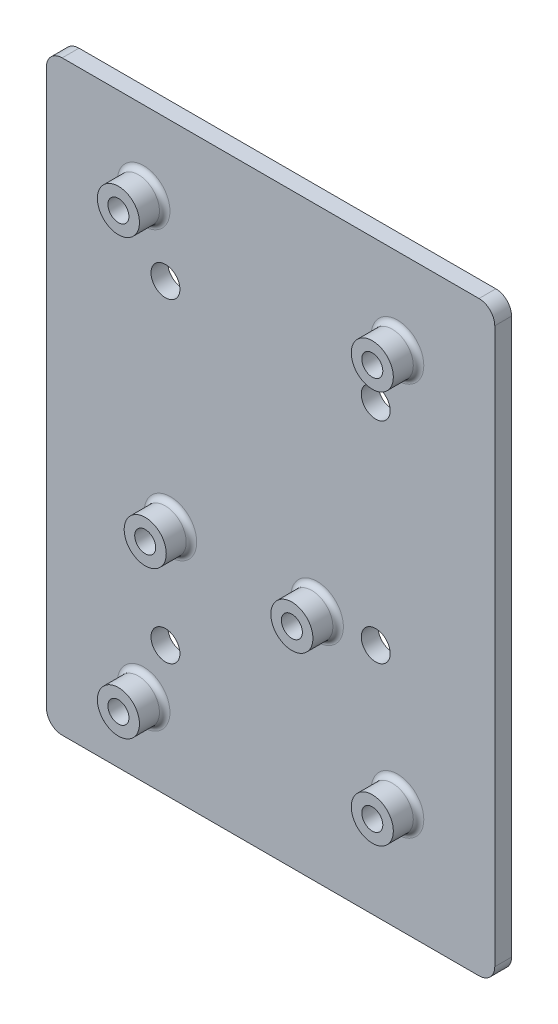
ISO-10303-21;
HEADER;
FILE_DESCRIPTION(('STEP AP214'),'2;1');
FILE_NAME('part.step','',(''),(''),'','','');
FILE_SCHEMA(('AUTOMOTIVE_DESIGN { 1 0 10303 214 1 1 1 1 }'));
ENDSEC;
DATA;
#1=APPLICATION_CONTEXT('core data for automotive mechanical design processes');
#2=APPLICATION_PROTOCOL_DEFINITION('international standard','automotive_design',2000,#1);
#3=PRODUCT_CONTEXT('',#1,'mechanical');
#4=PRODUCT('Part','Part','',(#3));
#5=PRODUCT_RELATED_PRODUCT_CATEGORY('part','',(#4));
#6=PRODUCT_DEFINITION_FORMATION('','',#4);
#7=PRODUCT_DEFINITION_CONTEXT('part definition',#1,'design');
#8=PRODUCT_DEFINITION('design','',#6,#7);
#9=PRODUCT_DEFINITION_SHAPE('','',#8);
#10=(LENGTH_UNIT() NAMED_UNIT(*) SI_UNIT(.MILLI.,.METRE.));
#11=(NAMED_UNIT(*) PLANE_ANGLE_UNIT() SI_UNIT($,.RADIAN.));
#12=(NAMED_UNIT(*) SI_UNIT($,.STERADIAN.) SOLID_ANGLE_UNIT());
#13=UNCERTAINTY_MEASURE_WITH_UNIT(LENGTH_MEASURE(1.E-05),#10,'distance_accuracy_value','');
#14=(GEOMETRIC_REPRESENTATION_CONTEXT(3) GLOBAL_UNCERTAINTY_ASSIGNED_CONTEXT((#13)) GLOBAL_UNIT_ASSIGNED_CONTEXT((#10,
#11,#12)) REPRESENTATION_CONTEXT('',''));
#15=CARTESIAN_POINT('',(0.,0.,0.));
#16=DIRECTION('',(0.,0.,1.));
#17=DIRECTION('',(1.,0.,0.));
#18=AXIS2_PLACEMENT_3D('',#15,#16,#17);
#19=CARTESIAN_POINT('',(0.,0.,3.2));
#20=DIRECTION('',(0.,0.,1.));
#21=DIRECTION('',(1.,0.,0.));
#22=AXIS2_PLACEMENT_3D('',#19,#20,#21);
#23=PLANE('',#22);
#24=CARTESIAN_POINT('',(-5.10000000000008,52.,3.2));
#25=DIRECTION('',(0.,0.,1.));
#26=DIRECTION('',(1.,0.,0.));
#27=AXIS2_PLACEMENT_3D('',#24,#25,#26);
#28=CIRCLE('',#27,5.);
#29=CARTESIAN_POINT('',(-0.100000000000078,52.,3.2));
#30=VERTEX_POINT('',#29);
#31=EDGE_CURVE('E179',#30,#30,#28,.F.);
#32=ORIENTED_EDGE('',*,*,#31,.T.);
#33=EDGE_LOOP('',(#32));
#34=FACE_BOUND('',#33,.T.);
#35=CARTESIAN_POINT('',(43.2,50.7,3.2));
#36=DIRECTION('',(0.,0.,1.));
#37=DIRECTION('',(1.,0.,0.));
#38=AXIS2_PLACEMENT_3D('',#35,#36,#37);
#39=CIRCLE('',#38,5.);
#40=CARTESIAN_POINT('',(48.2,50.7,3.2));
#41=VERTEX_POINT('',#40);
#42=EDGE_CURVE('E176',#41,#41,#39,.F.);
#43=ORIENTED_EDGE('',*,*,#42,.T.);
#44=EDGE_LOOP('',(#43));
#45=FACE_BOUND('',#44,.T.);
#46=CARTESIAN_POINT('',(43.2,-24.1,3.2));
#47=DIRECTION('',(0.,0.,1.));
#48=DIRECTION('',(1.,0.,0.));
#49=AXIS2_PLACEMENT_3D('',#46,#47,#48);
#50=CIRCLE('',#49,5.00000000000001);
#51=CARTESIAN_POINT('',(48.2,-24.1,3.2));
#52=VERTEX_POINT('',#51);
#53=EDGE_CURVE('E173',#52,#52,#50,.F.);
#54=ORIENTED_EDGE('',*,*,#53,.T.);
#55=EDGE_LOOP('',(#54));
#56=FACE_BOUND('',#55,.T.);
#57=CARTESIAN_POINT('',(27.9,0.,3.2));
#58=DIRECTION('',(0.,0.,1.));
#59=DIRECTION('',(1.,0.,0.));
#60=AXIS2_PLACEMENT_3D('',#57,#58,#59);
#61=CIRCLE('',#60,5.);
#62=CARTESIAN_POINT('',(32.9,0.,3.2));
#63=VERTEX_POINT('',#62);
#64=EDGE_CURVE('E170',#63,#63,#61,.F.);
#65=ORIENTED_EDGE('',*,*,#64,.T.);
#66=EDGE_LOOP('',(#65));
#67=FACE_BOUND('',#66,.T.);
#68=CARTESIAN_POINT('',(0.,0.,3.2));
#69=DIRECTION('',(0.,0.,1.));
#70=DIRECTION('',(1.,0.,0.));
#71=AXIS2_PLACEMENT_3D('',#68,#69,#70);
#72=CIRCLE('',#71,5.);
#73=CARTESIAN_POINT('',(5.,0.,3.2));
#74=VERTEX_POINT('',#73);
#75=EDGE_CURVE('E167',#74,#74,#72,.F.);
#76=ORIENTED_EDGE('',*,*,#75,.T.);
#77=EDGE_LOOP('',(#76));
#78=FACE_BOUND('',#77,.T.);
#79=CARTESIAN_POINT('',(-5.10000000000007,-30.6,3.2));
#80=DIRECTION('',(0.,0.,1.));
#81=DIRECTION('',(1.,0.,0.));
#82=AXIS2_PLACEMENT_3D('',#79,#80,#81);
#83=CIRCLE('',#82,5.);
#84=CARTESIAN_POINT('',(-0.10000000000007,-30.6,3.2));
#85=VERTEX_POINT('',#84);
#86=EDGE_CURVE('E164',#85,#85,#83,.F.);
#87=ORIENTED_EDGE('',*,*,#86,.T.);
#88=EDGE_LOOP('',(#87));
#89=FACE_BOUND('',#88,.T.);
#90=CARTESIAN_POINT('',(-0.94999999999996,-19.95,3.2));
#91=DIRECTION('',(0.,0.,1.));
#92=DIRECTION('',(1.,0.,0.));
#93=AXIS2_PLACEMENT_3D('',#90,#91,#92);
#94=CIRCLE('',#93,2.75);
#95=CARTESIAN_POINT('',(1.80000000000004,-19.95,3.2));
#96=VERTEX_POINT('',#95);
#97=EDGE_CURVE('E303',#96,#96,#94,.T.);
#98=ORIENTED_EDGE('',*,*,#97,.F.);
#99=EDGE_LOOP('',(#98));
#100=FACE_BOUND('',#99,.T.);
#101=CARTESIAN_POINT('',(39.05,0.0499999999999529,3.2));
#102=DIRECTION('',(0.,0.,1.));
#103=DIRECTION('',(1.,0.,0.));
#104=AXIS2_PLACEMENT_3D('',#101,#102,#103);
#105=CIRCLE('',#104,2.75);
#106=CARTESIAN_POINT('',(41.8,0.0499999999999529,3.2));
#107=VERTEX_POINT('',#106);
#108=EDGE_CURVE('E309',#107,#107,#105,.T.);
#109=ORIENTED_EDGE('',*,*,#108,.F.);
#110=EDGE_LOOP('',(#109));
#111=FACE_BOUND('',#110,.T.);
#112=CARTESIAN_POINT('',(39.05,40.05,3.2));
#113=DIRECTION('',(0.,0.,1.));
#114=DIRECTION('',(1.,0.,0.));
#115=AXIS2_PLACEMENT_3D('',#112,#113,#114);
#116=CIRCLE('',#115,2.75);
#117=CARTESIAN_POINT('',(41.8,40.05,3.2));
#118=VERTEX_POINT('',#117);
#119=EDGE_CURVE('E443',#118,#118,#116,.T.);
#120=ORIENTED_EDGE('',*,*,#119,.F.);
#121=EDGE_LOOP('',(#120));
#122=FACE_BOUND('',#121,.T.);
#123=CARTESIAN_POINT('',(-0.94999999999996,40.05,3.2));
#124=DIRECTION('',(0.,0.,1.));
#125=DIRECTION('',(1.,0.,0.));
#126=AXIS2_PLACEMENT_3D('',#123,#124,#125);
#127=CIRCLE('',#126,2.75);
#128=CARTESIAN_POINT('',(1.80000000000004,40.05,3.2));
#129=VERTEX_POINT('',#128);
#130=EDGE_CURVE('E452',#129,#129,#127,.T.);
#131=ORIENTED_EDGE('',*,*,#130,.F.);
#132=EDGE_LOOP('',(#131));
#133=FACE_BOUND('',#132,.T.);
#134=DIRECTION('',(-1.,0.,0.));
#135=VECTOR('',#134,1.);
#136=CARTESIAN_POINT('',(0.,-44.6,3.2));
#137=LINE('',#136,#135);
#138=CARTESIAN_POINT('',(58.7,-44.6,3.2));
#139=VERTEX_POINT('',#138);
#140=CARTESIAN_POINT('',(-20.5999999999999,-44.6,3.2));
#141=VERTEX_POINT('',#140);
#142=EDGE_CURVE('E346',#139,#141,#137,.T.);
#143=ORIENTED_EDGE('',*,*,#142,.F.);
#144=CARTESIAN_POINT('',(58.7,-41.6,3.2));
#145=DIRECTION('',(0.,0.,1.));
#146=DIRECTION('',(1.,0.,0.));
#147=AXIS2_PLACEMENT_3D('',#144,#145,#146);
#148=CIRCLE('',#147,3.);
#149=CARTESIAN_POINT('',(61.7,-41.6,3.2));
#150=VERTEX_POINT('',#149);
#151=EDGE_CURVE('E151',#139,#150,#148,.T.);
#152=ORIENTED_EDGE('',*,*,#151,.T.);
#153=DIRECTION('',(0.,-1.,0.));
#154=VECTOR('',#153,1.);
#155=CARTESIAN_POINT('',(61.7,0.,3.2));
#156=LINE('',#155,#154);
#157=CARTESIAN_POINT('',(61.7,64.,3.2));
#158=VERTEX_POINT('',#157);
#159=EDGE_CURVE('E133',#158,#150,#156,.T.);
#160=ORIENTED_EDGE('',*,*,#159,.F.);
#161=CARTESIAN_POINT('',(58.7,64.,3.2));
#162=DIRECTION('',(0.,0.,1.));
#163=DIRECTION('',(1.,0.,0.));
#164=AXIS2_PLACEMENT_3D('',#161,#162,#163);
#165=CIRCLE('',#164,3.);
#166=CARTESIAN_POINT('',(58.7,67.,3.2));
#167=VERTEX_POINT('',#166);
#168=EDGE_CURVE('E56',#158,#167,#165,.T.);
#169=ORIENTED_EDGE('',*,*,#168,.T.);
#170=DIRECTION('',(1.,0.,0.));
#171=VECTOR('',#170,1.);
#172=CARTESIAN_POINT('',(0.,67.,3.2));
#173=LINE('',#172,#171);
#174=CARTESIAN_POINT('',(-20.5999999999999,67.,3.2));
#175=VERTEX_POINT('',#174);
#176=EDGE_CURVE('E130',#175,#167,#173,.T.);
#177=ORIENTED_EDGE('',*,*,#176,.F.);
#178=CARTESIAN_POINT('',(-20.5999999999999,64.,3.2));
#179=DIRECTION('',(0.,0.,1.));
#180=DIRECTION('',(1.,0.,0.));
#181=AXIS2_PLACEMENT_3D('',#178,#179,#180);
#182=CIRCLE('',#181,3.);
#183=CARTESIAN_POINT('',(-23.5999999999999,64.,3.2));
#184=VERTEX_POINT('',#183);
#185=EDGE_CURVE('E146',#175,#184,#182,.T.);
#186=ORIENTED_EDGE('',*,*,#185,.T.);
#187=DIRECTION('',(0.,1.,0.));
#188=VECTOR('',#187,1.);
#189=CARTESIAN_POINT('',(-23.5999999999999,0.,3.2));
#190=LINE('',#189,#188);
#191=CARTESIAN_POINT('',(-23.5999999999999,-41.6,3.2));
#192=VERTEX_POINT('',#191);
#193=EDGE_CURVE('E343',#192,#184,#190,.T.);
#194=ORIENTED_EDGE('',*,*,#193,.F.);
#195=CARTESIAN_POINT('',(-20.5999999999999,-41.6,3.2));
#196=DIRECTION('',(0.,0.,1.));
#197=DIRECTION('',(1.,0.,0.));
#198=AXIS2_PLACEMENT_3D('',#195,#196,#197);
#199=CIRCLE('',#198,3.);
#200=EDGE_CURVE('E149',#192,#141,#199,.T.);
#201=ORIENTED_EDGE('',*,*,#200,.T.);
#202=EDGE_LOOP('',(#143,#152,#160,#169,#177,#186,#194,#201));
#203=FACE_BOUND('',#202,.T.);
#204=ADVANCED_FACE('F41',(#34,#45,#56,#67,#78,#89,#100,#111,#122,#133,#203),#23,.T.);
#205=CARTESIAN_POINT('',(-23.5999999999999,0.,3.2));
#206=DIRECTION('',(-1.,0.,0.));
#207=DIRECTION('',(0.,-1.,0.));
#208=AXIS2_PLACEMENT_3D('',#205,#206,#207);
#209=PLANE('',#208);
#210=DIRECTION('',(0.,1.,0.));
#211=VECTOR('',#210,1.);
#212=CARTESIAN_POINT('',(-23.5999999999999,0.,0.));
#213=LINE('',#212,#211);
#214=CARTESIAN_POINT('',(-23.5999999999999,-41.6,0.));
#215=VERTEX_POINT('',#214);
#216=CARTESIAN_POINT('',(-23.5999999999999,64.,0.));
#217=VERTEX_POINT('',#216);
#218=EDGE_CURVE('E367',#215,#217,#213,.T.);
#219=ORIENTED_EDGE('',*,*,#218,.F.);
#220=DIRECTION('',(0.,0.,-1.));
#221=VECTOR('',#220,1.);
#222=CARTESIAN_POINT('',(-23.5999999999999,-41.6,3.2));
#223=LINE('',#222,#221);
#224=EDGE_CURVE('E156',#215,#192,#223,.F.);
#225=ORIENTED_EDGE('',*,*,#224,.T.);
#226=ORIENTED_EDGE('',*,*,#193,.T.);
#227=DIRECTION('',(0.,0.,-1.));
#228=VECTOR('',#227,1.);
#229=CARTESIAN_POINT('',(-23.5999999999999,64.,3.2));
#230=LINE('',#229,#228);
#231=EDGE_CURVE('E153',#184,#217,#230,.T.);
#232=ORIENTED_EDGE('',*,*,#231,.T.);
#233=EDGE_LOOP('',(#219,#225,#226,#232));
#234=FACE_BOUND('',#233,.T.);
#235=ADVANCED_FACE('F210',(#234),#209,.T.);
#236=CARTESIAN_POINT('',(0.,-44.6,3.2));
#237=DIRECTION('',(0.,-1.,0.));
#238=DIRECTION('',(1.,0.,0.));
#239=AXIS2_PLACEMENT_3D('',#236,#237,#238);
#240=PLANE('',#239);
#241=DIRECTION('',(-1.,0.,0.));
#242=VECTOR('',#241,1.);
#243=CARTESIAN_POINT('',(0.,-44.6,0.));
#244=LINE('',#243,#242);
#245=CARTESIAN_POINT('',(58.7,-44.6,0.));
#246=VERTEX_POINT('',#245);
#247=CARTESIAN_POINT('',(-20.5999999999999,-44.6,0.));
#248=VERTEX_POINT('',#247);
#249=EDGE_CURVE('E127',#246,#248,#244,.T.);
#250=ORIENTED_EDGE('',*,*,#249,.F.);
#251=DIRECTION('',(0.,0.,-1.));
#252=VECTOR('',#251,1.);
#253=CARTESIAN_POINT('',(58.7,-44.6,3.2));
#254=LINE('',#253,#252);
#255=EDGE_CURVE('E144',#246,#139,#254,.F.);
#256=ORIENTED_EDGE('',*,*,#255,.T.);
#257=ORIENTED_EDGE('',*,*,#142,.T.);
#258=DIRECTION('',(0.,0.,-1.));
#259=VECTOR('',#258,1.);
#260=CARTESIAN_POINT('',(-20.5999999999999,-44.6,3.2));
#261=LINE('',#260,#259);
#262=EDGE_CURVE('E141',#141,#248,#261,.T.);
#263=ORIENTED_EDGE('',*,*,#262,.T.);
#264=EDGE_LOOP('',(#250,#256,#257,#263));
#265=FACE_BOUND('',#264,.T.);
#266=ADVANCED_FACE('F218',(#265),#240,.T.);
#267=CARTESIAN_POINT('',(61.7,0.,3.2));
#268=DIRECTION('',(1.,0.,0.));
#269=DIRECTION('',(0.,1.,0.));
#270=AXIS2_PLACEMENT_3D('',#267,#268,#269);
#271=PLANE('',#270);
#272=ORIENTED_EDGE('',*,*,#159,.T.);
#273=DIRECTION('',(0.,0.,-1.));
#274=VECTOR('',#273,1.);
#275=CARTESIAN_POINT('',(61.7,-41.6,3.2));
#276=LINE('',#275,#274);
#277=CARTESIAN_POINT('',(61.7,-41.6,0.));
#278=VERTEX_POINT('',#277);
#279=EDGE_CURVE('E126',#150,#278,#276,.T.);
#280=ORIENTED_EDGE('',*,*,#279,.T.);
#281=DIRECTION('',(0.,-1.,0.));
#282=VECTOR('',#281,1.);
#283=CARTESIAN_POINT('',(61.7,0.,0.));
#284=LINE('',#283,#282);
#285=CARTESIAN_POINT('',(61.7,64.,0.));
#286=VERTEX_POINT('',#285);
#287=EDGE_CURVE('E111',#286,#278,#284,.T.);
#288=ORIENTED_EDGE('',*,*,#287,.F.);
#289=DIRECTION('',(0.,0.,-1.));
#290=VECTOR('',#289,1.);
#291=CARTESIAN_POINT('',(61.7,64.,3.2));
#292=LINE('',#291,#290);
#293=EDGE_CURVE('E124',#286,#158,#292,.F.);
#294=ORIENTED_EDGE('',*,*,#293,.T.);
#295=EDGE_LOOP('',(#272,#280,#288,#294));
#296=FACE_BOUND('',#295,.T.);
#297=ADVANCED_FACE('F123',(#296),#271,.T.);
#298=CARTESIAN_POINT('',(-5.10000000000008,52.,3.2));
#299=DIRECTION('',(0.,0.,-1.));
#300=DIRECTION('',(-1.,0.,0.));
#301=AXIS2_PLACEMENT_3D('',#298,#299,#300);
#302=CYLINDRICAL_SURFACE('',#301,2.);
#303=CARTESIAN_POINT('',(-5.10000000000008,52.,0.));
#304=DIRECTION('',(0.,0.,1.));
#305=DIRECTION('',(1.,0.,0.));
#306=AXIS2_PLACEMENT_3D('',#303,#304,#305);
#307=CIRCLE('',#306,2.);
#308=CARTESIAN_POINT('',(-3.10000000000008,52.,0.));
#309=VERTEX_POINT('',#308);
#310=EDGE_CURVE('E364',#309,#309,#307,.T.);
#311=ORIENTED_EDGE('',*,*,#310,.F.);
#312=EDGE_LOOP('',(#311));
#313=FACE_BOUND('',#312,.T.);
#314=CARTESIAN_POINT('',(-5.10000000000008,52.,8.));
#315=DIRECTION('',(0.,0.,1.));
#316=DIRECTION('',(1.,0.,0.));
#317=AXIS2_PLACEMENT_3D('',#314,#315,#316);
#318=CIRCLE('',#317,2.);
#319=CARTESIAN_POINT('',(-3.10000000000008,52.,8.));
#320=VERTEX_POINT('',#319);
#321=EDGE_CURVE('E320',#320,#320,#318,.T.);
#322=ORIENTED_EDGE('',*,*,#321,.T.);
#323=EDGE_LOOP('',(#322));
#324=FACE_BOUND('',#323,.T.);
#325=ADVANCED_FACE('F236',(#313,#324),#302,.F.);
#326=CARTESIAN_POINT('',(43.2,50.7,3.2));
#327=DIRECTION('',(0.,0.,-1.));
#328=DIRECTION('',(-1.,0.,0.));
#329=AXIS2_PLACEMENT_3D('',#326,#327,#328);
#330=CYLINDRICAL_SURFACE('',#329,2.);
#331=CARTESIAN_POINT('',(43.2,50.7,0.));
#332=DIRECTION('',(0.,0.,1.));
#333=DIRECTION('',(1.,0.,0.));
#334=AXIS2_PLACEMENT_3D('',#331,#332,#333);
#335=CIRCLE('',#334,2.);
#336=CARTESIAN_POINT('',(45.2,50.7,0.));
#337=VERTEX_POINT('',#336);
#338=EDGE_CURVE('E361',#337,#337,#335,.T.);
#339=ORIENTED_EDGE('',*,*,#338,.F.);
#340=EDGE_LOOP('',(#339));
#341=FACE_BOUND('',#340,.T.);
#342=CARTESIAN_POINT('',(43.2,50.7,8.));
#343=DIRECTION('',(0.,0.,1.));
#344=DIRECTION('',(1.,0.,0.));
#345=AXIS2_PLACEMENT_3D('',#342,#343,#344);
#346=CIRCLE('',#345,2.);
#347=CARTESIAN_POINT('',(45.2,50.7,8.));
#348=VERTEX_POINT('',#347);
#349=EDGE_CURVE('E316',#348,#348,#346,.T.);
#350=ORIENTED_EDGE('',*,*,#349,.T.);
#351=EDGE_LOOP('',(#350));
#352=FACE_BOUND('',#351,.T.);
#353=ADVANCED_FACE('F242',(#341,#352),#330,.F.);
#354=CARTESIAN_POINT('',(0.,0.,3.2));
#355=DIRECTION('',(0.,0.,-1.));
#356=DIRECTION('',(-1.,0.,0.));
#357=AXIS2_PLACEMENT_3D('',#354,#355,#356);
#358=CYLINDRICAL_SURFACE('',#357,2.);
#359=CARTESIAN_POINT('',(0.,0.,0.));
#360=DIRECTION('',(0.,0.,1.));
#361=DIRECTION('',(1.,0.,0.));
#362=AXIS2_PLACEMENT_3D('',#359,#360,#361);
#363=CIRCLE('',#362,2.);
#364=CARTESIAN_POINT('',(2.,0.,0.));
#365=VERTEX_POINT('',#364);
#366=EDGE_CURVE('E358',#365,#365,#363,.T.);
#367=ORIENTED_EDGE('',*,*,#366,.F.);
#368=EDGE_LOOP('',(#367));
#369=FACE_BOUND('',#368,.T.);
#370=CARTESIAN_POINT('',(0.,0.,8.));
#371=DIRECTION('',(0.,0.,1.));
#372=DIRECTION('',(1.,0.,0.));
#373=AXIS2_PLACEMENT_3D('',#370,#371,#372);
#374=CIRCLE('',#373,2.);
#375=CARTESIAN_POINT('',(2.,0.,8.));
#376=VERTEX_POINT('',#375);
#377=EDGE_CURVE('E324',#376,#376,#374,.T.);
#378=ORIENTED_EDGE('',*,*,#377,.T.);
#379=EDGE_LOOP('',(#378));
#380=FACE_BOUND('',#379,.T.);
#381=ADVANCED_FACE('F246',(#369,#380),#358,.F.);
#382=CARTESIAN_POINT('',(27.9,0.,3.2));
#383=DIRECTION('',(0.,0.,-1.));
#384=DIRECTION('',(-1.,0.,0.));
#385=AXIS2_PLACEMENT_3D('',#382,#383,#384);
#386=CYLINDRICAL_SURFACE('',#385,2.);
#387=CARTESIAN_POINT('',(27.9,0.,0.));
#388=DIRECTION('',(0.,0.,1.));
#389=DIRECTION('',(1.,0.,0.));
#390=AXIS2_PLACEMENT_3D('',#387,#388,#389);
#391=CIRCLE('',#390,2.);
#392=CARTESIAN_POINT('',(29.9,0.,0.));
#393=VERTEX_POINT('',#392);
#394=EDGE_CURVE('E355',#393,#393,#391,.T.);
#395=ORIENTED_EDGE('',*,*,#394,.F.);
#396=EDGE_LOOP('',(#395));
#397=FACE_BOUND('',#396,.T.);
#398=CARTESIAN_POINT('',(27.9,0.,8.));
#399=DIRECTION('',(0.,0.,1.));
#400=DIRECTION('',(1.,0.,0.));
#401=AXIS2_PLACEMENT_3D('',#398,#399,#400);
#402=CIRCLE('',#401,2.);
#403=CARTESIAN_POINT('',(29.9,0.,8.));
#404=VERTEX_POINT('',#403);
#405=EDGE_CURVE('E317',#404,#404,#402,.T.);
#406=ORIENTED_EDGE('',*,*,#405,.T.);
#407=EDGE_LOOP('',(#406));
#408=FACE_BOUND('',#407,.T.);
#409=ADVANCED_FACE('F250',(#397,#408),#386,.F.);
#410=CARTESIAN_POINT('',(-5.10000000000007,-30.6,3.2));
#411=DIRECTION('',(0.,0.,-1.));
#412=DIRECTION('',(-1.,0.,0.));
#413=AXIS2_PLACEMENT_3D('',#410,#411,#412);
#414=CYLINDRICAL_SURFACE('',#413,2.);
#415=CARTESIAN_POINT('',(-5.10000000000007,-30.6,0.));
#416=DIRECTION('',(0.,0.,1.));
#417=DIRECTION('',(1.,0.,0.));
#418=AXIS2_PLACEMENT_3D('',#415,#416,#417);
#419=CIRCLE('',#418,2.);
#420=CARTESIAN_POINT('',(-3.10000000000007,-30.6,0.));
#421=VERTEX_POINT('',#420);
#422=EDGE_CURVE('E352',#421,#421,#419,.T.);
#423=ORIENTED_EDGE('',*,*,#422,.F.);
#424=EDGE_LOOP('',(#423));
#425=FACE_BOUND('',#424,.T.);
#426=CARTESIAN_POINT('',(-5.10000000000007,-30.6,8.));
#427=DIRECTION('',(0.,0.,1.));
#428=DIRECTION('',(1.,0.,0.));
#429=AXIS2_PLACEMENT_3D('',#426,#427,#428);
#430=CIRCLE('',#429,2.);
#431=CARTESIAN_POINT('',(-3.10000000000007,-30.6,8.));
#432=VERTEX_POINT('',#431);
#433=EDGE_CURVE('E330',#432,#432,#430,.T.);
#434=ORIENTED_EDGE('',*,*,#433,.T.);
#435=EDGE_LOOP('',(#434));
#436=FACE_BOUND('',#435,.T.);
#437=ADVANCED_FACE('F254',(#425,#436),#414,.F.);
#438=CARTESIAN_POINT('',(43.2,-24.1,3.2));
#439=DIRECTION('',(0.,0.,-1.));
#440=DIRECTION('',(-1.,0.,0.));
#441=AXIS2_PLACEMENT_3D('',#438,#439,#440);
#442=CYLINDRICAL_SURFACE('',#441,2.);
#443=CARTESIAN_POINT('',(43.2,-24.1,0.));
#444=DIRECTION('',(0.,0.,1.));
#445=DIRECTION('',(1.,0.,0.));
#446=AXIS2_PLACEMENT_3D('',#443,#444,#445);
#447=CIRCLE('',#446,2.);
#448=CARTESIAN_POINT('',(45.2,-24.1,0.));
#449=VERTEX_POINT('',#448);
#450=EDGE_CURVE('E342',#449,#449,#447,.T.);
#451=ORIENTED_EDGE('',*,*,#450,.F.);
#452=EDGE_LOOP('',(#451));
#453=FACE_BOUND('',#452,.T.);
#454=CARTESIAN_POINT('',(43.2,-24.1,8.));
#455=DIRECTION('',(0.,0.,1.));
#456=DIRECTION('',(1.,0.,0.));
#457=AXIS2_PLACEMENT_3D('',#454,#455,#456);
#458=CIRCLE('',#457,2.);
#459=CARTESIAN_POINT('',(45.2,-24.1,8.));
#460=VERTEX_POINT('',#459);
#461=EDGE_CURVE('E302',#460,#460,#458,.T.);
#462=ORIENTED_EDGE('',*,*,#461,.T.);
#463=EDGE_LOOP('',(#462));
#464=FACE_BOUND('',#463,.T.);
#465=ADVANCED_FACE('F233',(#453,#464),#442,.F.);
#466=CARTESIAN_POINT('',(0.,67.,3.2));
#467=DIRECTION('',(0.,1.,0.));
#468=DIRECTION('',(0.,0.,1.));
#469=AXIS2_PLACEMENT_3D('',#466,#467,#468);
#470=PLANE('',#469);
#471=ORIENTED_EDGE('',*,*,#176,.T.);
#472=DIRECTION('',(0.,0.,-1.));
#473=VECTOR('',#472,1.);
#474=CARTESIAN_POINT('',(58.7,67.,3.2));
#475=LINE('',#474,#473);
#476=CARTESIAN_POINT('',(58.7,67.,0.));
#477=VERTEX_POINT('',#476);
#478=EDGE_CURVE('E159',#167,#477,#475,.T.);
#479=ORIENTED_EDGE('',*,*,#478,.T.);
#480=DIRECTION('',(1.,0.,0.));
#481=VECTOR('',#480,1.);
#482=CARTESIAN_POINT('',(0.,67.,0.));
#483=LINE('',#482,#481);
#484=CARTESIAN_POINT('',(-20.5999999999999,67.,0.));
#485=VERTEX_POINT('',#484);
#486=EDGE_CURVE('E112',#485,#477,#483,.T.);
#487=ORIENTED_EDGE('',*,*,#486,.F.);
#488=DIRECTION('',(0.,0.,-1.));
#489=VECTOR('',#488,1.);
#490=CARTESIAN_POINT('',(-20.5999999999999,67.,3.2));
#491=LINE('',#490,#489);
#492=EDGE_CURVE('E63',#485,#175,#491,.F.);
#493=ORIENTED_EDGE('',*,*,#492,.T.);
#494=EDGE_LOOP('',(#471,#479,#487,#493));
#495=FACE_BOUND('',#494,.T.);
#496=ADVANCED_FACE('F229',(#495),#470,.T.);
#497=CARTESIAN_POINT('',(0.,0.,0.));
#498=DIRECTION('',(0.,0.,1.));
#499=DIRECTION('',(1.,0.,0.));
#500=AXIS2_PLACEMENT_3D('',#497,#498,#499);
#501=PLANE('',#500);
#502=CARTESIAN_POINT('',(-0.94999999999996,-19.95,0.));
#503=DIRECTION('',(0.,0.,1.));
#504=DIRECTION('',(1.,0.,0.));
#505=AXIS2_PLACEMENT_3D('',#502,#503,#504);
#506=CIRCLE('',#505,2.75);
#507=CARTESIAN_POINT('',(1.80000000000004,-19.95,0.));
#508=VERTEX_POINT('',#507);
#509=EDGE_CURVE('E455',#508,#508,#506,.T.);
#510=ORIENTED_EDGE('',*,*,#509,.T.);
#511=EDGE_LOOP('',(#510));
#512=FACE_BOUND('',#511,.T.);
#513=CARTESIAN_POINT('',(39.05,0.0499999999999529,0.));
#514=DIRECTION('',(0.,0.,1.));
#515=DIRECTION('',(1.,0.,0.));
#516=AXIS2_PLACEMENT_3D('',#513,#514,#515);
#517=CIRCLE('',#516,2.75);
#518=CARTESIAN_POINT('',(41.8,0.0499999999999529,0.));
#519=VERTEX_POINT('',#518);
#520=EDGE_CURVE('E449',#519,#519,#517,.T.);
#521=ORIENTED_EDGE('',*,*,#520,.T.);
#522=EDGE_LOOP('',(#521));
#523=FACE_BOUND('',#522,.T.);
#524=CARTESIAN_POINT('',(39.05,40.05,0.));
#525=DIRECTION('',(0.,0.,1.));
#526=DIRECTION('',(1.,0.,0.));
#527=AXIS2_PLACEMENT_3D('',#524,#525,#526);
#528=CIRCLE('',#527,2.75);
#529=CARTESIAN_POINT('',(41.8,40.05,0.));
#530=VERTEX_POINT('',#529);
#531=EDGE_CURVE('E446',#530,#530,#528,.T.);
#532=ORIENTED_EDGE('',*,*,#531,.T.);
#533=EDGE_LOOP('',(#532));
#534=FACE_BOUND('',#533,.T.);
#535=CARTESIAN_POINT('',(-0.94999999999996,40.05,0.));
#536=DIRECTION('',(0.,0.,1.));
#537=DIRECTION('',(1.,0.,0.));
#538=AXIS2_PLACEMENT_3D('',#535,#536,#537);
#539=CIRCLE('',#538,2.75);
#540=CARTESIAN_POINT('',(1.80000000000004,40.05,0.));
#541=VERTEX_POINT('',#540);
#542=EDGE_CURVE('E448',#541,#541,#539,.T.);
#543=ORIENTED_EDGE('',*,*,#542,.T.);
#544=EDGE_LOOP('',(#543));
#545=FACE_BOUND('',#544,.T.);
#546=ORIENTED_EDGE('',*,*,#450,.T.);
#547=EDGE_LOOP('',(#546));
#548=FACE_BOUND('',#547,.T.);
#549=ORIENTED_EDGE('',*,*,#422,.T.);
#550=EDGE_LOOP('',(#549));
#551=FACE_BOUND('',#550,.T.);
#552=ORIENTED_EDGE('',*,*,#394,.T.);
#553=EDGE_LOOP('',(#552));
#554=FACE_BOUND('',#553,.T.);
#555=ORIENTED_EDGE('',*,*,#366,.T.);
#556=EDGE_LOOP('',(#555));
#557=FACE_BOUND('',#556,.T.);
#558=ORIENTED_EDGE('',*,*,#338,.T.);
#559=EDGE_LOOP('',(#558));
#560=FACE_BOUND('',#559,.T.);
#561=ORIENTED_EDGE('',*,*,#310,.T.);
#562=EDGE_LOOP('',(#561));
#563=FACE_BOUND('',#562,.T.);
#564=ORIENTED_EDGE('',*,*,#287,.T.);
#565=CARTESIAN_POINT('',(58.7,-41.6,0.));
#566=DIRECTION('',(0.,0.,1.));
#567=DIRECTION('',(1.,0.,0.));
#568=AXIS2_PLACEMENT_3D('',#565,#566,#567);
#569=CIRCLE('',#568,3.);
#570=EDGE_CURVE('E139',#278,#246,#569,.F.);
#571=ORIENTED_EDGE('',*,*,#570,.T.);
#572=ORIENTED_EDGE('',*,*,#249,.T.);
#573=CARTESIAN_POINT('',(-20.5999999999999,-41.6,0.));
#574=DIRECTION('',(0.,0.,1.));
#575=DIRECTION('',(1.,0.,0.));
#576=AXIS2_PLACEMENT_3D('',#573,#574,#575);
#577=CIRCLE('',#576,3.);
#578=EDGE_CURVE('E117',#248,#215,#577,.F.);
#579=ORIENTED_EDGE('',*,*,#578,.T.);
#580=ORIENTED_EDGE('',*,*,#218,.T.);
#581=CARTESIAN_POINT('',(-20.5999999999999,64.,0.));
#582=DIRECTION('',(0.,0.,1.));
#583=DIRECTION('',(1.,0.,0.));
#584=AXIS2_PLACEMENT_3D('',#581,#582,#583);
#585=CIRCLE('',#584,3.);
#586=EDGE_CURVE('E118',#217,#485,#585,.F.);
#587=ORIENTED_EDGE('',*,*,#586,.T.);
#588=ORIENTED_EDGE('',*,*,#486,.T.);
#589=CARTESIAN_POINT('',(58.7,64.,0.));
#590=DIRECTION('',(0.,0.,1.));
#591=DIRECTION('',(1.,0.,0.));
#592=AXIS2_PLACEMENT_3D('',#589,#590,#591);
#593=CIRCLE('',#592,3.);
#594=EDGE_CURVE('E108',#477,#286,#593,.F.);
#595=ORIENTED_EDGE('',*,*,#594,.T.);
#596=EDGE_LOOP('',(#564,#571,#572,#579,#580,#587,#588,#595));
#597=FACE_BOUND('',#596,.T.);
#598=ADVANCED_FACE('F110',(#512,#523,#534,#545,#548,#551,#554,#557,#560,#563,#597),#501,.F.);
#599=CARTESIAN_POINT('',(-5.10000000000008,52.,8.));
#600=DIRECTION('',(0.,0.,1.));
#601=DIRECTION('',(1.,0.,0.));
#602=AXIS2_PLACEMENT_3D('',#599,#600,#601);
#603=PLANE('',#602);
#604=CARTESIAN_POINT('',(-5.10000000000008,52.,8.));
#605=DIRECTION('',(0.,0.,1.));
#606=DIRECTION('',(1.,0.,0.));
#607=AXIS2_PLACEMENT_3D('',#604,#605,#606);
#608=CIRCLE('',#607,4.);
#609=CARTESIAN_POINT('',(-1.10000000000008,52.,8.));
#610=VERTEX_POINT('',#609);
#611=EDGE_CURVE('E339',#610,#610,#608,.T.);
#612=ORIENTED_EDGE('',*,*,#611,.T.);
#613=EDGE_LOOP('',(#612));
#614=FACE_BOUND('',#613,.T.);
#615=ORIENTED_EDGE('',*,*,#321,.F.);
#616=EDGE_LOOP('',(#615));
#617=FACE_BOUND('',#616,.T.);
#618=ADVANCED_FACE('F228',(#614,#617),#603,.T.);
#619=CARTESIAN_POINT('',(-5.10000000000008,52.,8.));
#620=DIRECTION('',(0.,0.,-1.));
#621=DIRECTION('',(-1.,0.,0.));
#622=AXIS2_PLACEMENT_3D('',#619,#620,#621);
#623=CYLINDRICAL_SURFACE('',#622,4.);
#624=CARTESIAN_POINT('',(-5.10000000000008,52.,4.2));
#625=DIRECTION('',(0.,0.,1.));
#626=DIRECTION('',(1.,0.,0.));
#627=AXIS2_PLACEMENT_3D('',#624,#625,#626);
#628=CIRCLE('',#627,4.);
#629=CARTESIAN_POINT('',(-1.10000000000008,52.,4.2));
#630=VERTEX_POINT('',#629);
#631=EDGE_CURVE('E161',#630,#630,#628,.T.);
#632=ORIENTED_EDGE('',*,*,#631,.T.);
#633=EDGE_LOOP('',(#632));
#634=FACE_BOUND('',#633,.T.);
#635=ORIENTED_EDGE('',*,*,#611,.F.);
#636=EDGE_LOOP('',(#635));
#637=FACE_BOUND('',#636,.T.);
#638=ADVANCED_FACE('F224',(#634,#637),#623,.T.);
#639=CARTESIAN_POINT('',(43.2,-24.1,8.));
#640=DIRECTION('',(0.,0.,1.));
#641=DIRECTION('',(1.,0.,0.));
#642=AXIS2_PLACEMENT_3D('',#639,#640,#641);
#643=PLANE('',#642);
#644=CARTESIAN_POINT('',(43.2,-24.1,8.));
#645=DIRECTION('',(0.,0.,1.));
#646=DIRECTION('',(1.,0.,0.));
#647=AXIS2_PLACEMENT_3D('',#644,#645,#646);
#648=CIRCLE('',#647,4.00000000000001);
#649=CARTESIAN_POINT('',(47.2,-24.1,8.));
#650=VERTEX_POINT('',#649);
#651=EDGE_CURVE('E300',#650,#650,#648,.T.);
#652=ORIENTED_EDGE('',*,*,#651,.T.);
#653=EDGE_LOOP('',(#652));
#654=FACE_BOUND('',#653,.T.);
#655=ORIENTED_EDGE('',*,*,#461,.F.);
#656=EDGE_LOOP('',(#655));
#657=FACE_BOUND('',#656,.T.);
#658=ADVANCED_FACE('F296',(#654,#657),#643,.T.);
#659=CARTESIAN_POINT('',(43.2,-24.1,8.));
#660=DIRECTION('',(0.,0.,-1.));
#661=DIRECTION('',(-1.,0.,0.));
#662=AXIS2_PLACEMENT_3D('',#659,#660,#661);
#663=CYLINDRICAL_SURFACE('',#662,4.00000000000001);
#664=CARTESIAN_POINT('',(43.2,-24.1,4.2));
#665=DIRECTION('',(0.,0.,1.));
#666=DIRECTION('',(1.,0.,0.));
#667=AXIS2_PLACEMENT_3D('',#664,#665,#666);
#668=CIRCLE('',#667,4.00000000000001);
#669=CARTESIAN_POINT('',(47.2,-24.1,4.2));
#670=VERTEX_POINT('',#669);
#671=EDGE_CURVE('E185',#670,#670,#668,.T.);
#672=ORIENTED_EDGE('',*,*,#671,.T.);
#673=EDGE_LOOP('',(#672));
#674=FACE_BOUND('',#673,.T.);
#675=ORIENTED_EDGE('',*,*,#651,.F.);
#676=EDGE_LOOP('',(#675));
#677=FACE_BOUND('',#676,.T.);
#678=ADVANCED_FACE('F292',(#674,#677),#663,.T.);
#679=CARTESIAN_POINT('',(-5.10000000000007,-30.6,8.));
#680=DIRECTION('',(0.,0.,1.));
#681=DIRECTION('',(1.,0.,0.));
#682=AXIS2_PLACEMENT_3D('',#679,#680,#681);
#683=PLANE('',#682);
#684=CARTESIAN_POINT('',(-5.10000000000007,-30.6,8.));
#685=DIRECTION('',(0.,0.,1.));
#686=DIRECTION('',(1.,0.,0.));
#687=AXIS2_PLACEMENT_3D('',#684,#685,#686);
#688=CIRCLE('',#687,4.);
#689=CARTESIAN_POINT('',(-1.10000000000007,-30.6,8.));
#690=VERTEX_POINT('',#689);
#691=EDGE_CURVE('E306',#690,#690,#688,.T.);
#692=ORIENTED_EDGE('',*,*,#691,.T.);
#693=EDGE_LOOP('',(#692));
#694=FACE_BOUND('',#693,.T.);
#695=ORIENTED_EDGE('',*,*,#433,.F.);
#696=EDGE_LOOP('',(#695));
#697=FACE_BOUND('',#696,.T.);
#698=ADVANCED_FACE('F295',(#694,#697),#683,.T.);
#699=CARTESIAN_POINT('',(-5.10000000000007,-30.6,8.));
#700=DIRECTION('',(0.,0.,-1.));
#701=DIRECTION('',(-1.,0.,0.));
#702=AXIS2_PLACEMENT_3D('',#699,#700,#701);
#703=CYLINDRICAL_SURFACE('',#702,4.);
#704=CARTESIAN_POINT('',(-5.10000000000007,-30.6,4.2));
#705=DIRECTION('',(0.,0.,1.));
#706=DIRECTION('',(1.,0.,0.));
#707=AXIS2_PLACEMENT_3D('',#704,#705,#706);
#708=CIRCLE('',#707,4.);
#709=CARTESIAN_POINT('',(-1.10000000000007,-30.6,4.2));
#710=VERTEX_POINT('',#709);
#711=EDGE_CURVE('E11',#710,#710,#708,.T.);
#712=ORIENTED_EDGE('',*,*,#711,.T.);
#713=EDGE_LOOP('',(#712));
#714=FACE_BOUND('',#713,.T.);
#715=ORIENTED_EDGE('',*,*,#691,.F.);
#716=EDGE_LOOP('',(#715));
#717=FACE_BOUND('',#716,.T.);
#718=ADVANCED_FACE('F396',(#714,#717),#703,.T.);
#719=CARTESIAN_POINT('',(0.,0.,8.));
#720=DIRECTION('',(0.,0.,1.));
#721=DIRECTION('',(1.,0.,0.));
#722=AXIS2_PLACEMENT_3D('',#719,#720,#721);
#723=PLANE('',#722);
#724=CARTESIAN_POINT('',(0.,0.,8.));
#725=DIRECTION('',(0.,0.,1.));
#726=DIRECTION('',(1.,0.,0.));
#727=AXIS2_PLACEMENT_3D('',#724,#725,#726);
#728=CIRCLE('',#727,4.);
#729=CARTESIAN_POINT('',(4.,0.,8.));
#730=VERTEX_POINT('',#729);
#731=EDGE_CURVE('E327',#730,#730,#728,.T.);
#732=ORIENTED_EDGE('',*,*,#731,.T.);
#733=EDGE_LOOP('',(#732));
#734=FACE_BOUND('',#733,.T.);
#735=ORIENTED_EDGE('',*,*,#377,.F.);
#736=EDGE_LOOP('',(#735));
#737=FACE_BOUND('',#736,.T.);
#738=ADVANCED_FACE('F400',(#734,#737),#723,.T.);
#739=CARTESIAN_POINT('',(0.,0.,8.));
#740=DIRECTION('',(0.,0.,-1.));
#741=DIRECTION('',(-1.,0.,0.));
#742=AXIS2_PLACEMENT_3D('',#739,#740,#741);
#743=CYLINDRICAL_SURFACE('',#742,4.);
#744=CARTESIAN_POINT('',(0.,0.,4.2));
#745=DIRECTION('',(0.,0.,1.));
#746=DIRECTION('',(1.,0.,0.));
#747=AXIS2_PLACEMENT_3D('',#744,#745,#746);
#748=CIRCLE('',#747,4.);
#749=CARTESIAN_POINT('',(4.,0.,4.2));
#750=VERTEX_POINT('',#749);
#751=EDGE_CURVE('E49',#750,#750,#748,.T.);
#752=ORIENTED_EDGE('',*,*,#751,.T.);
#753=EDGE_LOOP('',(#752));
#754=FACE_BOUND('',#753,.T.);
#755=ORIENTED_EDGE('',*,*,#731,.F.);
#756=EDGE_LOOP('',(#755));
#757=FACE_BOUND('',#756,.T.);
#758=ADVANCED_FACE('F193',(#754,#757),#743,.T.);
#759=CARTESIAN_POINT('',(27.9,0.,8.));
#760=DIRECTION('',(0.,0.,1.));
#761=DIRECTION('',(1.,0.,0.));
#762=AXIS2_PLACEMENT_3D('',#759,#760,#761);
#763=PLANE('',#762);
#764=CARTESIAN_POINT('',(27.9,0.,8.));
#765=DIRECTION('',(0.,0.,1.));
#766=DIRECTION('',(1.,0.,0.));
#767=AXIS2_PLACEMENT_3D('',#764,#765,#766);
#768=CIRCLE('',#767,4.);
#769=CARTESIAN_POINT('',(31.9,0.,8.));
#770=VERTEX_POINT('',#769);
#771=EDGE_CURVE('E321',#770,#770,#768,.T.);
#772=ORIENTED_EDGE('',*,*,#771,.T.);
#773=EDGE_LOOP('',(#772));
#774=FACE_BOUND('',#773,.T.);
#775=ORIENTED_EDGE('',*,*,#405,.F.);
#776=EDGE_LOOP('',(#775));
#777=FACE_BOUND('',#776,.T.);
#778=ADVANCED_FACE('F407',(#774,#777),#763,.T.);
#779=CARTESIAN_POINT('',(27.9,0.,8.));
#780=DIRECTION('',(0.,0.,-1.));
#781=DIRECTION('',(-1.,0.,0.));
#782=AXIS2_PLACEMENT_3D('',#779,#780,#781);
#783=CYLINDRICAL_SURFACE('',#782,4.);
#784=CARTESIAN_POINT('',(27.9,0.,4.2));
#785=DIRECTION('',(0.,0.,1.));
#786=DIRECTION('',(1.,0.,0.));
#787=AXIS2_PLACEMENT_3D('',#784,#785,#786);
#788=CIRCLE('',#787,4.);
#789=CARTESIAN_POINT('',(31.9,0.,4.2));
#790=VERTEX_POINT('',#789);
#791=EDGE_CURVE('E188',#790,#790,#788,.T.);
#792=ORIENTED_EDGE('',*,*,#791,.T.);
#793=EDGE_LOOP('',(#792));
#794=FACE_BOUND('',#793,.T.);
#795=ORIENTED_EDGE('',*,*,#771,.F.);
#796=EDGE_LOOP('',(#795));
#797=FACE_BOUND('',#796,.T.);
#798=ADVANCED_FACE('F410',(#794,#797),#783,.T.);
#799=CARTESIAN_POINT('',(43.2,50.7,8.));
#800=DIRECTION('',(0.,0.,1.));
#801=DIRECTION('',(1.,0.,0.));
#802=AXIS2_PLACEMENT_3D('',#799,#800,#801);
#803=PLANE('',#802);
#804=CARTESIAN_POINT('',(43.2,50.7,8.));
#805=DIRECTION('',(0.,0.,1.));
#806=DIRECTION('',(1.,0.,0.));
#807=AXIS2_PLACEMENT_3D('',#804,#805,#806);
#808=CIRCLE('',#807,4.);
#809=CARTESIAN_POINT('',(47.2,50.7,8.));
#810=VERTEX_POINT('',#809);
#811=EDGE_CURVE('E313',#810,#810,#808,.T.);
#812=ORIENTED_EDGE('',*,*,#811,.T.);
#813=EDGE_LOOP('',(#812));
#814=FACE_BOUND('',#813,.T.);
#815=ORIENTED_EDGE('',*,*,#349,.F.);
#816=EDGE_LOOP('',(#815));
#817=FACE_BOUND('',#816,.T.);
#818=ADVANCED_FACE('F414',(#814,#817),#803,.T.);
#819=CARTESIAN_POINT('',(43.2,50.7,8.));
#820=DIRECTION('',(0.,0.,-1.));
#821=DIRECTION('',(-1.,0.,0.));
#822=AXIS2_PLACEMENT_3D('',#819,#820,#821);
#823=CYLINDRICAL_SURFACE('',#822,4.);
#824=CARTESIAN_POINT('',(43.2,50.7,4.2));
#825=DIRECTION('',(0.,0.,1.));
#826=DIRECTION('',(1.,0.,0.));
#827=AXIS2_PLACEMENT_3D('',#824,#825,#826);
#828=CIRCLE('',#827,4.);
#829=CARTESIAN_POINT('',(47.2,50.7,4.2));
#830=VERTEX_POINT('',#829);
#831=EDGE_CURVE('E182',#830,#830,#828,.T.);
#832=ORIENTED_EDGE('',*,*,#831,.T.);
#833=EDGE_LOOP('',(#832));
#834=FACE_BOUND('',#833,.T.);
#835=ORIENTED_EDGE('',*,*,#811,.F.);
#836=EDGE_LOOP('',(#835));
#837=FACE_BOUND('',#836,.T.);
#838=ADVANCED_FACE('F418',(#834,#837),#823,.T.);
#839=CARTESIAN_POINT('',(-0.94999999999996,40.05,0.));
#840=DIRECTION('',(0.,0.,1.));
#841=DIRECTION('',(1.,0.,0.));
#842=AXIS2_PLACEMENT_3D('',#839,#840,#841);
#843=CYLINDRICAL_SURFACE('',#842,2.75);
#844=ORIENTED_EDGE('',*,*,#130,.T.);
#845=EDGE_LOOP('',(#844));
#846=FACE_BOUND('',#845,.T.);
#847=ORIENTED_EDGE('',*,*,#542,.F.);
#848=EDGE_LOOP('',(#847));
#849=FACE_BOUND('',#848,.T.);
#850=ADVANCED_FACE('F422',(#846,#849),#843,.F.);
#851=CARTESIAN_POINT('',(39.05,40.05,0.));
#852=DIRECTION('',(0.,0.,1.));
#853=DIRECTION('',(1.,0.,0.));
#854=AXIS2_PLACEMENT_3D('',#851,#852,#853);
#855=CYLINDRICAL_SURFACE('',#854,2.75);
#856=ORIENTED_EDGE('',*,*,#119,.T.);
#857=EDGE_LOOP('',(#856));
#858=FACE_BOUND('',#857,.T.);
#859=ORIENTED_EDGE('',*,*,#531,.F.);
#860=EDGE_LOOP('',(#859));
#861=FACE_BOUND('',#860,.T.);
#862=ADVANCED_FACE('F427',(#858,#861),#855,.F.);
#863=CARTESIAN_POINT('',(39.05,0.0499999999999529,0.));
#864=DIRECTION('',(0.,0.,1.));
#865=DIRECTION('',(1.,0.,0.));
#866=AXIS2_PLACEMENT_3D('',#863,#864,#865);
#867=CYLINDRICAL_SURFACE('',#866,2.75);
#868=ORIENTED_EDGE('',*,*,#108,.T.);
#869=EDGE_LOOP('',(#868));
#870=FACE_BOUND('',#869,.T.);
#871=ORIENTED_EDGE('',*,*,#520,.F.);
#872=EDGE_LOOP('',(#871));
#873=FACE_BOUND('',#872,.T.);
#874=ADVANCED_FACE('F431',(#870,#873),#867,.F.);
#875=CARTESIAN_POINT('',(-0.94999999999996,-19.95,0.));
#876=DIRECTION('',(0.,0.,1.));
#877=DIRECTION('',(1.,0.,0.));
#878=AXIS2_PLACEMENT_3D('',#875,#876,#877);
#879=CYLINDRICAL_SURFACE('',#878,2.75);
#880=ORIENTED_EDGE('',*,*,#97,.T.);
#881=EDGE_LOOP('',(#880));
#882=FACE_BOUND('',#881,.T.);
#883=ORIENTED_EDGE('',*,*,#509,.F.);
#884=EDGE_LOOP('',(#883));
#885=FACE_BOUND('',#884,.T.);
#886=ADVANCED_FACE('F266',(#882,#885),#879,.F.);
#887=CARTESIAN_POINT('',(58.7,-41.6,3.2));
#888=DIRECTION('',(0.,0.,-1.));
#889=DIRECTION('',(-1.,0.,0.));
#890=AXIS2_PLACEMENT_3D('',#887,#888,#889);
#891=CYLINDRICAL_SURFACE('',#890,3.);
#892=ORIENTED_EDGE('',*,*,#151,.F.);
#893=ORIENTED_EDGE('',*,*,#255,.F.);
#894=ORIENTED_EDGE('',*,*,#570,.F.);
#895=ORIENTED_EDGE('',*,*,#279,.F.);
#896=EDGE_LOOP('',(#892,#893,#894,#895));
#897=FACE_BOUND('',#896,.T.);
#898=ADVANCED_FACE('F262',(#897),#891,.T.);
#899=CARTESIAN_POINT('',(-20.5999999999999,-41.6,3.2));
#900=DIRECTION('',(0.,0.,-1.));
#901=DIRECTION('',(-1.,0.,0.));
#902=AXIS2_PLACEMENT_3D('',#899,#900,#901);
#903=CYLINDRICAL_SURFACE('',#902,3.);
#904=ORIENTED_EDGE('',*,*,#200,.F.);
#905=ORIENTED_EDGE('',*,*,#224,.F.);
#906=ORIENTED_EDGE('',*,*,#578,.F.);
#907=ORIENTED_EDGE('',*,*,#262,.F.);
#908=EDGE_LOOP('',(#904,#905,#906,#907));
#909=FACE_BOUND('',#908,.T.);
#910=ADVANCED_FACE('F265',(#909),#903,.T.);
#911=CARTESIAN_POINT('',(58.7,64.,3.2));
#912=DIRECTION('',(0.,0.,-1.));
#913=DIRECTION('',(-1.,0.,0.));
#914=AXIS2_PLACEMENT_3D('',#911,#912,#913);
#915=CYLINDRICAL_SURFACE('',#914,3.);
#916=ORIENTED_EDGE('',*,*,#168,.F.);
#917=ORIENTED_EDGE('',*,*,#293,.F.);
#918=ORIENTED_EDGE('',*,*,#594,.F.);
#919=ORIENTED_EDGE('',*,*,#478,.F.);
#920=EDGE_LOOP('',(#916,#917,#918,#919));
#921=FACE_BOUND('',#920,.T.);
#922=ADVANCED_FACE('F129',(#921),#915,.T.);
#923=CARTESIAN_POINT('',(-20.5999999999999,64.,3.2));
#924=DIRECTION('',(0.,0.,-1.));
#925=DIRECTION('',(-1.,0.,0.));
#926=AXIS2_PLACEMENT_3D('',#923,#924,#925);
#927=CYLINDRICAL_SURFACE('',#926,3.);
#928=ORIENTED_EDGE('',*,*,#185,.F.);
#929=ORIENTED_EDGE('',*,*,#492,.F.);
#930=ORIENTED_EDGE('',*,*,#586,.F.);
#931=ORIENTED_EDGE('',*,*,#231,.F.);
#932=EDGE_LOOP('',(#928,#929,#930,#931));
#933=FACE_BOUND('',#932,.T.);
#934=ADVANCED_FACE('F273',(#933),#927,.T.);
#935=CARTESIAN_POINT('',(-5.10000000000008,52.,4.2));
#936=DIRECTION('',(0.,0.,1.));
#937=DIRECTION('',(1.,0.,0.));
#938=AXIS2_PLACEMENT_3D('',#935,#936,#937);
#939=TOROIDAL_SURFACE('',#938,5.,1.);
#940=ORIENTED_EDGE('',*,*,#31,.F.);
#941=EDGE_LOOP('',(#940));
#942=FACE_BOUND('',#941,.T.);
#943=ORIENTED_EDGE('',*,*,#631,.F.);
#944=EDGE_LOOP('',(#943));
#945=FACE_BOUND('',#944,.T.);
#946=ADVANCED_FACE('F275',(#942,#945),#939,.F.);
#947=CARTESIAN_POINT('',(43.2,50.7,4.2));
#948=DIRECTION('',(0.,0.,1.));
#949=DIRECTION('',(1.,0.,0.));
#950=AXIS2_PLACEMENT_3D('',#947,#948,#949);
#951=TOROIDAL_SURFACE('',#950,5.,1.);
#952=ORIENTED_EDGE('',*,*,#42,.F.);
#953=EDGE_LOOP('',(#952));
#954=FACE_BOUND('',#953,.T.);
#955=ORIENTED_EDGE('',*,*,#831,.F.);
#956=EDGE_LOOP('',(#955));
#957=FACE_BOUND('',#956,.T.);
#958=ADVANCED_FACE('F279',(#954,#957),#951,.F.);
#959=CARTESIAN_POINT('',(43.2,-24.1,4.2));
#960=DIRECTION('',(0.,0.,1.));
#961=DIRECTION('',(1.,0.,0.));
#962=AXIS2_PLACEMENT_3D('',#959,#960,#961);
#963=TOROIDAL_SURFACE('',#962,5.00000000000001,1.);
#964=ORIENTED_EDGE('',*,*,#53,.F.);
#965=EDGE_LOOP('',(#964));
#966=FACE_BOUND('',#965,.T.);
#967=ORIENTED_EDGE('',*,*,#671,.F.);
#968=EDGE_LOOP('',(#967));
#969=FACE_BOUND('',#968,.T.);
#970=ADVANCED_FACE('F205',(#966,#969),#963,.F.);
#971=CARTESIAN_POINT('',(27.9,0.,4.2));
#972=DIRECTION('',(0.,0.,1.));
#973=DIRECTION('',(1.,0.,0.));
#974=AXIS2_PLACEMENT_3D('',#971,#972,#973);
#975=TOROIDAL_SURFACE('',#974,5.,1.);
#976=ORIENTED_EDGE('',*,*,#64,.F.);
#977=EDGE_LOOP('',(#976));
#978=FACE_BOUND('',#977,.T.);
#979=ORIENTED_EDGE('',*,*,#791,.F.);
#980=EDGE_LOOP('',(#979));
#981=FACE_BOUND('',#980,.T.);
#982=ADVANCED_FACE('F198',(#978,#981),#975,.F.);
#983=CARTESIAN_POINT('',(0.,0.,4.2));
#984=DIRECTION('',(0.,0.,1.));
#985=DIRECTION('',(1.,0.,0.));
#986=AXIS2_PLACEMENT_3D('',#983,#984,#985);
#987=TOROIDAL_SURFACE('',#986,5.,1.);
#988=ORIENTED_EDGE('',*,*,#75,.F.);
#989=EDGE_LOOP('',(#988));
#990=FACE_BOUND('',#989,.T.);
#991=ORIENTED_EDGE('',*,*,#751,.F.);
#992=EDGE_LOOP('',(#991));
#993=FACE_BOUND('',#992,.T.);
#994=ADVANCED_FACE('F196',(#990,#993),#987,.F.);
#995=CARTESIAN_POINT('',(-5.10000000000007,-30.6,4.2));
#996=DIRECTION('',(0.,0.,1.));
#997=DIRECTION('',(1.,0.,0.));
#998=AXIS2_PLACEMENT_3D('',#995,#996,#997);
#999=TOROIDAL_SURFACE('',#998,5.,1.);
#1000=ORIENTED_EDGE('',*,*,#86,.F.);
#1001=EDGE_LOOP('',(#1000));
#1002=FACE_BOUND('',#1001,.T.);
#1003=ORIENTED_EDGE('',*,*,#711,.F.);
#1004=EDGE_LOOP('',(#1003));
#1005=FACE_BOUND('',#1004,.T.);
#1006=ADVANCED_FACE('F43',(#1002,#1005),#999,.F.);
#1007=CLOSED_SHELL('',(#204,#235,#266,#297,#325,#353,#381,#409,#437,#465,#496,#598,#618,#638,
#658,#678,#698,#718,#738,#758,#778,#798,#818,#838,#850,#862,#874,#886,#898,#910,#922,#934,#946,
#958,#970,#982,#994,#1006));
#1008=MANIFOLD_SOLID_BREP('B2',#1007);
#1009=ADVANCED_BREP_SHAPE_REPRESENTATION('',(#18,#1008),#14);
#1010=SHAPE_DEFINITION_REPRESENTATION(#9,#1009);
ENDSEC;
END-ISO-10303-21;
